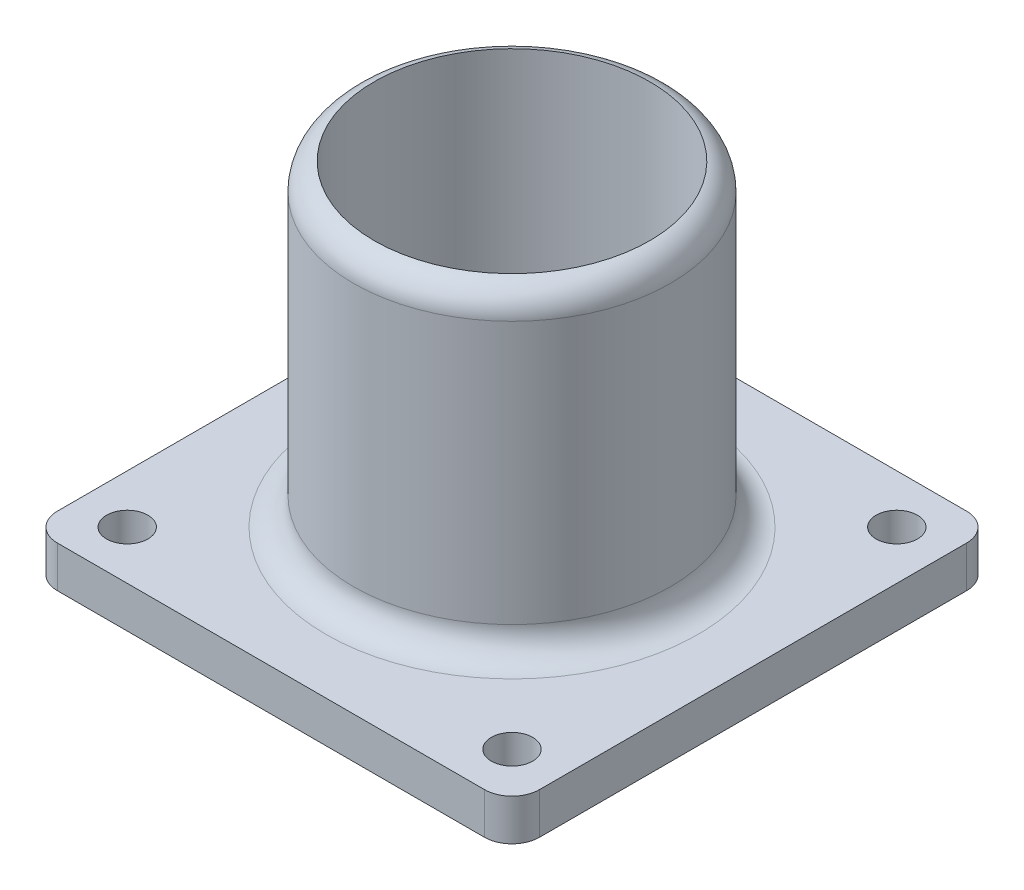
ISO-10303-21;
HEADER;
FILE_DESCRIPTION(('STEP AP214'),'2;1');
FILE_NAME('part.step','',(''),(''),'','','');
FILE_SCHEMA(('AUTOMOTIVE_DESIGN { 1 0 10303 214 1 1 1 1 }'));
ENDSEC;
DATA;
#1=APPLICATION_CONTEXT('core data for automotive mechanical design processes');
#2=APPLICATION_PROTOCOL_DEFINITION('international standard','automotive_design',2000,#1);
#3=PRODUCT_CONTEXT('',#1,'mechanical');
#4=PRODUCT('Part','Part','',(#3));
#5=PRODUCT_RELATED_PRODUCT_CATEGORY('part','',(#4));
#6=PRODUCT_DEFINITION_FORMATION('','',#4);
#7=PRODUCT_DEFINITION_CONTEXT('part definition',#1,'design');
#8=PRODUCT_DEFINITION('design','',#6,#7);
#9=PRODUCT_DEFINITION_SHAPE('','',#8);
#10=(LENGTH_UNIT() NAMED_UNIT(*) SI_UNIT(.MILLI.,.METRE.));
#11=(NAMED_UNIT(*) PLANE_ANGLE_UNIT() SI_UNIT($,.RADIAN.));
#12=(NAMED_UNIT(*) SI_UNIT($,.STERADIAN.) SOLID_ANGLE_UNIT());
#13=UNCERTAINTY_MEASURE_WITH_UNIT(LENGTH_MEASURE(1.E-05),#10,'distance_accuracy_value','');
#14=(GEOMETRIC_REPRESENTATION_CONTEXT(3) GLOBAL_UNCERTAINTY_ASSIGNED_CONTEXT((#13)) GLOBAL_UNIT_ASSIGNED_CONTEXT((#10,
#11,#12)) REPRESENTATION_CONTEXT('',''));
#15=CARTESIAN_POINT('',(0.,0.,0.));
#16=DIRECTION('',(0.,0.,1.));
#17=DIRECTION('',(1.,0.,0.));
#18=AXIS2_PLACEMENT_3D('',#15,#16,#17);
#19=CARTESIAN_POINT('',(0.,1.5,0.));
#20=DIRECTION('',(0.,-1.,0.));
#21=DIRECTION('',(0.,0.,-1.));
#22=AXIS2_PLACEMENT_3D('',#19,#20,#21);
#23=PLANE('',#22);
#24=CARTESIAN_POINT('',(0.,1.5,0.));
#25=DIRECTION('',(0.,-1.,0.));
#26=DIRECTION('',(0.,0.,-1.));
#27=AXIS2_PLACEMENT_3D('',#24,#25,#26);
#28=CIRCLE('',#27,13.5);
#29=CARTESIAN_POINT('',(0.,1.5,-13.5));
#30=VERTEX_POINT('',#29);
#31=EDGE_CURVE('E11',#30,#30,#28,.T.);
#32=ORIENTED_EDGE('',*,*,#31,.T.);
#33=EDGE_LOOP('',(#32));
#34=FACE_BOUND('',#33,.T.);
#35=CARTESIAN_POINT('',(-13.9644660940674,1.5,13.9644660940671));
#36=DIRECTION('',(0.,1.,0.));
#37=DIRECTION('',(0.,0.,1.));
#38=AXIS2_PLACEMENT_3D('',#35,#36,#37);
#39=CIRCLE('',#38,1.5);
#40=CARTESIAN_POINT('',(-13.9644660940674,1.5,15.4644660940671));
#41=VERTEX_POINT('',#40);
#42=EDGE_CURVE('E262',#41,#41,#39,.T.);
#43=ORIENTED_EDGE('',*,*,#42,.F.);
#44=EDGE_LOOP('',(#43));
#45=FACE_BOUND('',#44,.T.);
#46=CARTESIAN_POINT('',(13.9644660940672,1.5,13.9644660940674));
#47=DIRECTION('',(0.,1.,0.));
#48=DIRECTION('',(0.,0.,1.));
#49=AXIS2_PLACEMENT_3D('',#46,#47,#48);
#50=CIRCLE('',#49,1.5);
#51=CARTESIAN_POINT('',(13.9644660940672,1.5,15.4644660940674));
#52=VERTEX_POINT('',#51);
#53=EDGE_CURVE('E256',#52,#52,#50,.T.);
#54=ORIENTED_EDGE('',*,*,#53,.F.);
#55=EDGE_LOOP('',(#54));
#56=FACE_BOUND('',#55,.T.);
#57=CARTESIAN_POINT('',(13.9644660940673,1.5,-13.9644660940672));
#58=DIRECTION('',(0.,1.,0.));
#59=DIRECTION('',(0.,0.,1.));
#60=AXIS2_PLACEMENT_3D('',#57,#58,#59);
#61=CIRCLE('',#60,1.5);
#62=CARTESIAN_POINT('',(13.9644660940673,1.5,-12.4644660940672));
#63=VERTEX_POINT('',#62);
#64=EDGE_CURVE('E251',#63,#63,#61,.T.);
#65=ORIENTED_EDGE('',*,*,#64,.F.);
#66=EDGE_LOOP('',(#65));
#67=FACE_BOUND('',#66,.T.);
#68=CARTESIAN_POINT('',(-13.9644660940673,1.5,-13.9644660940673));
#69=DIRECTION('',(0.,1.,0.));
#70=DIRECTION('',(0.,0.,1.));
#71=AXIS2_PLACEMENT_3D('',#68,#69,#70);
#72=CIRCLE('',#71,1.5);
#73=CARTESIAN_POINT('',(-13.9644660940673,1.5,-12.4644660940673));
#74=VERTEX_POINT('',#73);
#75=EDGE_CURVE('E241',#74,#74,#72,.T.);
#76=ORIENTED_EDGE('',*,*,#75,.F.);
#77=EDGE_LOOP('',(#76));
#78=FACE_BOUND('',#77,.T.);
#79=DIRECTION('',(-1.,0.,0.));
#80=VECTOR('',#79,1.);
#81=CARTESIAN_POINT('',(-17.5,1.5,-17.5));
#82=LINE('',#81,#80);
#83=CARTESIAN_POINT('',(15.5,1.5,-17.5));
#84=VERTEX_POINT('',#83);
#85=CARTESIAN_POINT('',(-15.5,1.5,-17.5));
#86=VERTEX_POINT('',#85);
#87=EDGE_CURVE('E234',#84,#86,#82,.T.);
#88=ORIENTED_EDGE('',*,*,#87,.T.);
#89=CARTESIAN_POINT('',(-15.5,1.5,-15.5));
#90=DIRECTION('',(0.,-1.,0.));
#91=DIRECTION('',(0.,0.,-1.));
#92=AXIS2_PLACEMENT_3D('',#89,#90,#91);
#93=CIRCLE('',#92,2.);
#94=CARTESIAN_POINT('',(-17.5,1.5,-15.5));
#95=VERTEX_POINT('',#94);
#96=EDGE_CURVE('E152',#86,#95,#93,.F.);
#97=ORIENTED_EDGE('',*,*,#96,.T.);
#98=DIRECTION('',(0.,0.,1.));
#99=VECTOR('',#98,1.);
#100=CARTESIAN_POINT('',(-17.5,1.5,17.5));
#101=LINE('',#100,#99);
#102=CARTESIAN_POINT('',(-17.5,1.5,15.5));
#103=VERTEX_POINT('',#102);
#104=EDGE_CURVE('E122',#95,#103,#101,.T.);
#105=ORIENTED_EDGE('',*,*,#104,.T.);
#106=CARTESIAN_POINT('',(-15.5,1.5,15.5));
#107=DIRECTION('',(0.,-1.,0.));
#108=DIRECTION('',(0.,0.,-1.));
#109=AXIS2_PLACEMENT_3D('',#106,#107,#108);
#110=CIRCLE('',#109,2.);
#111=CARTESIAN_POINT('',(-15.5,1.5,17.5));
#112=VERTEX_POINT('',#111);
#113=EDGE_CURVE('E58',#103,#112,#110,.F.);
#114=ORIENTED_EDGE('',*,*,#113,.T.);
#115=DIRECTION('',(1.,0.,0.));
#116=VECTOR('',#115,1.);
#117=CARTESIAN_POINT('',(-17.5,1.5,17.5));
#118=LINE('',#117,#116);
#119=CARTESIAN_POINT('',(15.5,1.5,17.5));
#120=VERTEX_POINT('',#119);
#121=EDGE_CURVE('E137',#112,#120,#118,.T.);
#122=ORIENTED_EDGE('',*,*,#121,.T.);
#123=CARTESIAN_POINT('',(15.5,1.5,15.5));
#124=DIRECTION('',(0.,-1.,0.));
#125=DIRECTION('',(0.,0.,-1.));
#126=AXIS2_PLACEMENT_3D('',#123,#124,#125);
#127=CIRCLE('',#126,2.);
#128=CARTESIAN_POINT('',(17.5,1.5,15.5));
#129=VERTEX_POINT('',#128);
#130=EDGE_CURVE('E147',#120,#129,#127,.F.);
#131=ORIENTED_EDGE('',*,*,#130,.T.);
#132=DIRECTION('',(0.,0.,-1.));
#133=VECTOR('',#132,1.);
#134=CARTESIAN_POINT('',(17.5,1.5,17.5));
#135=LINE('',#134,#133);
#136=CARTESIAN_POINT('',(17.5,1.5,-15.5));
#137=VERTEX_POINT('',#136);
#138=EDGE_CURVE('E134',#129,#137,#135,.T.);
#139=ORIENTED_EDGE('',*,*,#138,.T.);
#140=CARTESIAN_POINT('',(15.5,1.5,-15.5));
#141=DIRECTION('',(0.,-1.,0.));
#142=DIRECTION('',(0.,0.,-1.));
#143=AXIS2_PLACEMENT_3D('',#140,#141,#142);
#144=CIRCLE('',#143,2.);
#145=EDGE_CURVE('E155',#137,#84,#144,.F.);
#146=ORIENTED_EDGE('',*,*,#145,.T.);
#147=EDGE_LOOP('',(#88,#97,#105,#114,#122,#131,#139,#146));
#148=FACE_BOUND('',#147,.T.);
#149=ADVANCED_FACE('F36',(#34,#45,#56,#67,#78,#148),#23,.F.);
#150=CARTESIAN_POINT('',(0.,-1.5,0.));
#151=DIRECTION('',(0.,-1.,0.));
#152=DIRECTION('',(0.,0.,-1.));
#153=AXIS2_PLACEMENT_3D('',#150,#151,#152);
#154=PLANE('',#153);
#155=CARTESIAN_POINT('',(13.9644660940672,-1.5,13.9644660940674));
#156=DIRECTION('',(0.,1.,0.));
#157=DIRECTION('',(0.,0.,1.));
#158=AXIS2_PLACEMENT_3D('',#155,#156,#157);
#159=CIRCLE('',#158,1.5);
#160=CARTESIAN_POINT('',(13.9644660940672,-1.5,15.4644660940674));
#161=VERTEX_POINT('',#160);
#162=EDGE_CURVE('E261',#161,#161,#159,.T.);
#163=ORIENTED_EDGE('',*,*,#162,.T.);
#164=EDGE_LOOP('',(#163));
#165=FACE_BOUND('',#164,.T.);
#166=CARTESIAN_POINT('',(-13.9644660940673,-1.5,-13.9644660940673));
#167=DIRECTION('',(0.,1.,0.));
#168=DIRECTION('',(0.,0.,1.));
#169=AXIS2_PLACEMENT_3D('',#166,#167,#168);
#170=CIRCLE('',#169,1.5);
#171=CARTESIAN_POINT('',(-13.9644660940673,-1.5,-12.4644660940673));
#172=VERTEX_POINT('',#171);
#173=EDGE_CURVE('E246',#172,#172,#170,.T.);
#174=ORIENTED_EDGE('',*,*,#173,.T.);
#175=EDGE_LOOP('',(#174));
#176=FACE_BOUND('',#175,.T.);
#177=DIRECTION('',(0.,0.,1.));
#178=VECTOR('',#177,1.);
#179=CARTESIAN_POINT('',(-17.5,-1.5,17.5));
#180=LINE('',#179,#178);
#181=CARTESIAN_POINT('',(-17.5,-1.5,-15.5));
#182=VERTEX_POINT('',#181);
#183=CARTESIAN_POINT('',(-17.5,-1.5,15.5));
#184=VERTEX_POINT('',#183);
#185=EDGE_CURVE('E125',#182,#184,#180,.T.);
#186=ORIENTED_EDGE('',*,*,#185,.F.);
#187=CARTESIAN_POINT('',(-15.5,-1.5,-15.5));
#188=DIRECTION('',(0.,-1.,0.));
#189=DIRECTION('',(0.,0.,-1.));
#190=AXIS2_PLACEMENT_3D('',#187,#188,#189);
#191=CIRCLE('',#190,2.);
#192=CARTESIAN_POINT('',(-15.5,-1.5,-17.5));
#193=VERTEX_POINT('',#192);
#194=EDGE_CURVE('E104',#182,#193,#191,.T.);
#195=ORIENTED_EDGE('',*,*,#194,.T.);
#196=DIRECTION('',(-1.,0.,0.));
#197=VECTOR('',#196,1.);
#198=CARTESIAN_POINT('',(-17.5,-1.5,-17.5));
#199=LINE('',#198,#197);
#200=CARTESIAN_POINT('',(15.5,-1.5,-17.5));
#201=VERTEX_POINT('',#200);
#202=EDGE_CURVE('E135',#201,#193,#199,.T.);
#203=ORIENTED_EDGE('',*,*,#202,.F.);
#204=CARTESIAN_POINT('',(15.5,-1.5,-15.5));
#205=DIRECTION('',(0.,-1.,0.));
#206=DIRECTION('',(0.,0.,-1.));
#207=AXIS2_PLACEMENT_3D('',#204,#205,#206);
#208=CIRCLE('',#207,2.);
#209=CARTESIAN_POINT('',(17.5,-1.5,-15.5));
#210=VERTEX_POINT('',#209);
#211=EDGE_CURVE('E117',#201,#210,#208,.T.);
#212=ORIENTED_EDGE('',*,*,#211,.T.);
#213=DIRECTION('',(0.,0.,-1.));
#214=VECTOR('',#213,1.);
#215=CARTESIAN_POINT('',(17.5,-1.5,17.5));
#216=LINE('',#215,#214);
#217=CARTESIAN_POINT('',(17.5,-1.5,15.5));
#218=VERTEX_POINT('',#217);
#219=EDGE_CURVE('E138',#218,#210,#216,.T.);
#220=ORIENTED_EDGE('',*,*,#219,.F.);
#221=CARTESIAN_POINT('',(15.5,-1.5,15.5));
#222=DIRECTION('',(0.,-1.,0.));
#223=DIRECTION('',(0.,0.,-1.));
#224=AXIS2_PLACEMENT_3D('',#221,#222,#223);
#225=CIRCLE('',#224,2.);
#226=CARTESIAN_POINT('',(15.5,-1.5,17.5));
#227=VERTEX_POINT('',#226);
#228=EDGE_CURVE('E141',#218,#227,#225,.T.);
#229=ORIENTED_EDGE('',*,*,#228,.T.);
#230=DIRECTION('',(1.,0.,0.));
#231=VECTOR('',#230,1.);
#232=CARTESIAN_POINT('',(-17.5,-1.5,17.5));
#233=LINE('',#232,#231);
#234=CARTESIAN_POINT('',(-15.5,-1.5,17.5));
#235=VERTEX_POINT('',#234);
#236=EDGE_CURVE('E132',#235,#227,#233,.T.);
#237=ORIENTED_EDGE('',*,*,#236,.F.);
#238=CARTESIAN_POINT('',(-15.5,-1.5,15.5));
#239=DIRECTION('',(0.,-1.,0.));
#240=DIRECTION('',(0.,0.,-1.));
#241=AXIS2_PLACEMENT_3D('',#238,#239,#240);
#242=CIRCLE('',#241,2.);
#243=EDGE_CURVE('E124',#235,#184,#242,.T.);
#244=ORIENTED_EDGE('',*,*,#243,.T.);
#245=EDGE_LOOP('',(#186,#195,#203,#212,#220,#229,#237,#244));
#246=FACE_BOUND('',#245,.T.);
#247=CARTESIAN_POINT('',(0.,-1.5,0.));
#248=DIRECTION('',(0.,1.,0.));
#249=DIRECTION('',(0.,0.,1.));
#250=AXIS2_PLACEMENT_3D('',#247,#248,#249);
#251=CIRCLE('',#250,10.);
#252=CARTESIAN_POINT('',(0.,-1.5,10.));
#253=VERTEX_POINT('',#252);
#254=EDGE_CURVE('E238',#253,#253,#251,.T.);
#255=ORIENTED_EDGE('',*,*,#254,.T.);
#256=EDGE_LOOP('',(#255));
#257=FACE_BOUND('',#256,.T.);
#258=CARTESIAN_POINT('',(13.9644660940673,-1.5,-13.9644660940672));
#259=DIRECTION('',(0.,1.,0.));
#260=DIRECTION('',(0.,0.,1.));
#261=AXIS2_PLACEMENT_3D('',#258,#259,#260);
#262=CIRCLE('',#261,1.5);
#263=CARTESIAN_POINT('',(13.9644660940673,-1.5,-12.4644660940672));
#264=VERTEX_POINT('',#263);
#265=EDGE_CURVE('E254',#264,#264,#262,.T.);
#266=ORIENTED_EDGE('',*,*,#265,.T.);
#267=EDGE_LOOP('',(#266));
#268=FACE_BOUND('',#267,.T.);
#269=CARTESIAN_POINT('',(-13.9644660940674,-1.5,13.9644660940671));
#270=DIRECTION('',(0.,1.,0.));
#271=DIRECTION('',(0.,0.,1.));
#272=AXIS2_PLACEMENT_3D('',#269,#270,#271);
#273=CIRCLE('',#272,1.5);
#274=CARTESIAN_POINT('',(-13.9644660940674,-1.5,15.4644660940671));
#275=VERTEX_POINT('',#274);
#276=EDGE_CURVE('E270',#275,#275,#273,.T.);
#277=ORIENTED_EDGE('',*,*,#276,.T.);
#278=EDGE_LOOP('',(#277));
#279=FACE_BOUND('',#278,.T.);
#280=ADVANCED_FACE('F126',(#165,#176,#246,#257,#268,#279),#154,.T.);
#281=CARTESIAN_POINT('',(17.5,1.5,17.5));
#282=DIRECTION('',(-1.,0.,0.));
#283=DIRECTION('',(0.,0.,1.));
#284=AXIS2_PLACEMENT_3D('',#281,#282,#283);
#285=PLANE('',#284);
#286=ORIENTED_EDGE('',*,*,#219,.T.);
#287=DIRECTION('',(0.,-1.,0.));
#288=VECTOR('',#287,1.);
#289=CARTESIAN_POINT('',(17.5,1.5,-15.5));
#290=LINE('',#289,#288);
#291=EDGE_CURVE('E157',#210,#137,#290,.F.);
#292=ORIENTED_EDGE('',*,*,#291,.T.);
#293=ORIENTED_EDGE('',*,*,#138,.F.);
#294=DIRECTION('',(0.,-1.,0.));
#295=VECTOR('',#294,1.);
#296=CARTESIAN_POINT('',(17.5,1.5,15.5));
#297=LINE('',#296,#295);
#298=EDGE_CURVE('E156',#129,#218,#297,.T.);
#299=ORIENTED_EDGE('',*,*,#298,.T.);
#300=EDGE_LOOP('',(#286,#292,#293,#299));
#301=FACE_BOUND('',#300,.T.);
#302=ADVANCED_FACE('F195',(#301),#285,.F.);
#303=CARTESIAN_POINT('',(-17.5,1.5,-17.5));
#304=DIRECTION('',(0.,0.,1.));
#305=DIRECTION('',(1.,0.,0.));
#306=AXIS2_PLACEMENT_3D('',#303,#304,#305);
#307=PLANE('',#306);
#308=ORIENTED_EDGE('',*,*,#202,.T.);
#309=DIRECTION('',(0.,-1.,0.));
#310=VECTOR('',#309,1.);
#311=CARTESIAN_POINT('',(-15.5,1.5,-17.5));
#312=LINE('',#311,#310);
#313=EDGE_CURVE('E109',#193,#86,#312,.F.);
#314=ORIENTED_EDGE('',*,*,#313,.T.);
#315=ORIENTED_EDGE('',*,*,#87,.F.);
#316=DIRECTION('',(0.,-1.,0.));
#317=VECTOR('',#316,1.);
#318=CARTESIAN_POINT('',(15.5,1.5,-17.5));
#319=LINE('',#318,#317);
#320=EDGE_CURVE('E113',#84,#201,#319,.T.);
#321=ORIENTED_EDGE('',*,*,#320,.T.);
#322=EDGE_LOOP('',(#308,#314,#315,#321));
#323=FACE_BOUND('',#322,.T.);
#324=ADVANCED_FACE('F202',(#323),#307,.F.);
#325=CARTESIAN_POINT('',(-17.5,1.5,17.5));
#326=DIRECTION('',(1.,0.,0.));
#327=DIRECTION('',(0.,0.,-1.));
#328=AXIS2_PLACEMENT_3D('',#325,#326,#327);
#329=PLANE('',#328);
#330=ORIENTED_EDGE('',*,*,#104,.F.);
#331=DIRECTION('',(0.,-1.,0.));
#332=VECTOR('',#331,1.);
#333=CARTESIAN_POINT('',(-17.5,1.5,-15.5));
#334=LINE('',#333,#332);
#335=EDGE_CURVE('E108',#95,#182,#334,.T.);
#336=ORIENTED_EDGE('',*,*,#335,.T.);
#337=ORIENTED_EDGE('',*,*,#185,.T.);
#338=DIRECTION('',(0.,-1.,0.));
#339=VECTOR('',#338,1.);
#340=CARTESIAN_POINT('',(-17.5,1.5,15.5));
#341=LINE('',#340,#339);
#342=EDGE_CURVE('E127',#184,#103,#341,.F.);
#343=ORIENTED_EDGE('',*,*,#342,.T.);
#344=EDGE_LOOP('',(#330,#336,#337,#343));
#345=FACE_BOUND('',#344,.T.);
#346=ADVANCED_FACE('F123',(#345),#329,.F.);
#347=CARTESIAN_POINT('',(-17.5,1.5,17.5));
#348=DIRECTION('',(0.,0.,-1.));
#349=DIRECTION('',(-1.,0.,0.));
#350=AXIS2_PLACEMENT_3D('',#347,#348,#349);
#351=PLANE('',#350);
#352=ORIENTED_EDGE('',*,*,#236,.T.);
#353=DIRECTION('',(0.,-1.,0.));
#354=VECTOR('',#353,1.);
#355=CARTESIAN_POINT('',(15.5,1.5,17.5));
#356=LINE('',#355,#354);
#357=EDGE_CURVE('E52',#227,#120,#356,.F.);
#358=ORIENTED_EDGE('',*,*,#357,.T.);
#359=ORIENTED_EDGE('',*,*,#121,.F.);
#360=DIRECTION('',(0.,-1.,0.));
#361=VECTOR('',#360,1.);
#362=CARTESIAN_POINT('',(-15.5,1.5,17.5));
#363=LINE('',#362,#361);
#364=EDGE_CURVE('E161',#112,#235,#363,.T.);
#365=ORIENTED_EDGE('',*,*,#364,.T.);
#366=EDGE_LOOP('',(#352,#358,#359,#365));
#367=FACE_BOUND('',#366,.T.);
#368=ADVANCED_FACE('F199',(#367),#351,.F.);
#369=CARTESIAN_POINT('',(0.,1.5,0.));
#370=DIRECTION('',(0.,-1.,0.));
#371=DIRECTION('',(0.,0.,-1.));
#372=AXIS2_PLACEMENT_3D('',#369,#370,#371);
#373=CYLINDRICAL_SURFACE('',#372,10.);
#374=ORIENTED_EDGE('',*,*,#254,.F.);
#375=EDGE_LOOP('',(#374));
#376=FACE_BOUND('',#375,.T.);
#377=CARTESIAN_POINT('',(0.,24.5,0.));
#378=DIRECTION('',(0.,1.,0.));
#379=DIRECTION('',(0.,0.,1.));
#380=AXIS2_PLACEMENT_3D('',#377,#378,#379);
#381=CIRCLE('',#380,10.);
#382=CARTESIAN_POINT('',(0.,24.5,10.));
#383=VERTEX_POINT('',#382);
#384=EDGE_CURVE('E269',#383,#383,#381,.T.);
#385=ORIENTED_EDGE('',*,*,#384,.T.);
#386=EDGE_LOOP('',(#385));
#387=FACE_BOUND('',#386,.T.);
#388=ADVANCED_FACE('F197',(#376,#387),#373,.F.);
#389=CARTESIAN_POINT('',(-13.9644660940673,1.5,-13.9644660940673));
#390=DIRECTION('',(0.,-1.,0.));
#391=DIRECTION('',(0.,0.,-1.));
#392=AXIS2_PLACEMENT_3D('',#389,#390,#391);
#393=CYLINDRICAL_SURFACE('',#392,1.5);
#394=ORIENTED_EDGE('',*,*,#75,.T.);
#395=EDGE_LOOP('',(#394));
#396=FACE_BOUND('',#395,.T.);
#397=ORIENTED_EDGE('',*,*,#173,.F.);
#398=EDGE_LOOP('',(#397));
#399=FACE_BOUND('',#398,.T.);
#400=ADVANCED_FACE('F280',(#396,#399),#393,.F.);
#401=CARTESIAN_POINT('',(13.9644660940673,1.5,-13.9644660940672));
#402=DIRECTION('',(0.,-1.,0.));
#403=DIRECTION('',(0.,0.,-1.));
#404=AXIS2_PLACEMENT_3D('',#401,#402,#403);
#405=CYLINDRICAL_SURFACE('',#404,1.5);
#406=ORIENTED_EDGE('',*,*,#64,.T.);
#407=EDGE_LOOP('',(#406));
#408=FACE_BOUND('',#407,.T.);
#409=ORIENTED_EDGE('',*,*,#265,.F.);
#410=EDGE_LOOP('',(#409));
#411=FACE_BOUND('',#410,.T.);
#412=ADVANCED_FACE('F285',(#408,#411),#405,.F.);
#413=CARTESIAN_POINT('',(13.9644660940672,1.5,13.9644660940674));
#414=DIRECTION('',(0.,-1.,0.));
#415=DIRECTION('',(0.,0.,-1.));
#416=AXIS2_PLACEMENT_3D('',#413,#414,#415);
#417=CYLINDRICAL_SURFACE('',#416,1.5);
#418=ORIENTED_EDGE('',*,*,#53,.T.);
#419=EDGE_LOOP('',(#418));
#420=FACE_BOUND('',#419,.T.);
#421=ORIENTED_EDGE('',*,*,#162,.F.);
#422=EDGE_LOOP('',(#421));
#423=FACE_BOUND('',#422,.T.);
#424=ADVANCED_FACE('F288',(#420,#423),#417,.F.);
#425=CARTESIAN_POINT('',(-13.9644660940674,1.5,13.9644660940671));
#426=DIRECTION('',(0.,-1.,0.));
#427=DIRECTION('',(0.,0.,-1.));
#428=AXIS2_PLACEMENT_3D('',#425,#426,#427);
#429=CYLINDRICAL_SURFACE('',#428,1.5);
#430=ORIENTED_EDGE('',*,*,#42,.T.);
#431=EDGE_LOOP('',(#430));
#432=FACE_BOUND('',#431,.T.);
#433=ORIENTED_EDGE('',*,*,#276,.F.);
#434=EDGE_LOOP('',(#433));
#435=FACE_BOUND('',#434,.T.);
#436=ADVANCED_FACE('F214',(#432,#435),#429,.F.);
#437=CARTESIAN_POINT('',(-15.5,1.5,-15.5));
#438=DIRECTION('',(0.,-1.,0.));
#439=DIRECTION('',(0.,0.,-1.));
#440=AXIS2_PLACEMENT_3D('',#437,#438,#439);
#441=CYLINDRICAL_SURFACE('',#440,2.);
#442=ORIENTED_EDGE('',*,*,#96,.F.);
#443=ORIENTED_EDGE('',*,*,#313,.F.);
#444=ORIENTED_EDGE('',*,*,#194,.F.);
#445=ORIENTED_EDGE('',*,*,#335,.F.);
#446=EDGE_LOOP('',(#442,#443,#444,#445));
#447=FACE_BOUND('',#446,.T.);
#448=ADVANCED_FACE('F107',(#447),#441,.T.);
#449=CARTESIAN_POINT('',(15.5,1.5,-15.5));
#450=DIRECTION('',(0.,-1.,0.));
#451=DIRECTION('',(0.,0.,-1.));
#452=AXIS2_PLACEMENT_3D('',#449,#450,#451);
#453=CYLINDRICAL_SURFACE('',#452,2.);
#454=ORIENTED_EDGE('',*,*,#145,.F.);
#455=ORIENTED_EDGE('',*,*,#291,.F.);
#456=ORIENTED_EDGE('',*,*,#211,.F.);
#457=ORIENTED_EDGE('',*,*,#320,.F.);
#458=EDGE_LOOP('',(#454,#455,#456,#457));
#459=FACE_BOUND('',#458,.T.);
#460=ADVANCED_FACE('F212',(#459),#453,.T.);
#461=CARTESIAN_POINT('',(15.5,1.5,15.5));
#462=DIRECTION('',(0.,-1.,0.));
#463=DIRECTION('',(0.,0.,-1.));
#464=AXIS2_PLACEMENT_3D('',#461,#462,#463);
#465=CYLINDRICAL_SURFACE('',#464,2.);
#466=ORIENTED_EDGE('',*,*,#130,.F.);
#467=ORIENTED_EDGE('',*,*,#357,.F.);
#468=ORIENTED_EDGE('',*,*,#228,.F.);
#469=ORIENTED_EDGE('',*,*,#298,.F.);
#470=EDGE_LOOP('',(#466,#467,#468,#469));
#471=FACE_BOUND('',#470,.T.);
#472=ADVANCED_FACE('F217',(#471),#465,.T.);
#473=CARTESIAN_POINT('',(-15.5,1.5,15.5));
#474=DIRECTION('',(0.,-1.,0.));
#475=DIRECTION('',(0.,0.,-1.));
#476=AXIS2_PLACEMENT_3D('',#473,#474,#475);
#477=CYLINDRICAL_SURFACE('',#476,2.);
#478=ORIENTED_EDGE('',*,*,#113,.F.);
#479=ORIENTED_EDGE('',*,*,#342,.F.);
#480=ORIENTED_EDGE('',*,*,#243,.F.);
#481=ORIENTED_EDGE('',*,*,#364,.F.);
#482=EDGE_LOOP('',(#478,#479,#480,#481));
#483=FACE_BOUND('',#482,.T.);
#484=ADVANCED_FACE('F182',(#483),#477,.T.);
#485=CARTESIAN_POINT('',(0.,24.5,0.));
#486=DIRECTION('',(0.,-1.,0.));
#487=DIRECTION('',(0.,0.,-1.));
#488=AXIS2_PLACEMENT_3D('',#485,#486,#487);
#489=CYLINDRICAL_SURFACE('',#488,11.5);
#490=CARTESIAN_POINT('',(0.,3.5,0.));
#491=DIRECTION('',(0.,-1.,0.));
#492=DIRECTION('',(0.,0.,-1.));
#493=AXIS2_PLACEMENT_3D('',#490,#491,#492);
#494=CIRCLE('',#493,11.5);
#495=CARTESIAN_POINT('',(0.,3.5,-11.5));
#496=VERTEX_POINT('',#495);
#497=EDGE_CURVE('E46',#496,#496,#494,.F.);
#498=ORIENTED_EDGE('',*,*,#497,.T.);
#499=EDGE_LOOP('',(#498));
#500=FACE_BOUND('',#499,.T.);
#501=CARTESIAN_POINT('',(0.,22.5635083268963,0.));
#502=DIRECTION('',(0.,1.,0.));
#503=DIRECTION('',(0.,0.,1.));
#504=AXIS2_PLACEMENT_3D('',#501,#502,#503);
#505=CIRCLE('',#504,11.5);
#506=CARTESIAN_POINT('',(0.,22.5635083268963,11.5));
#507=VERTEX_POINT('',#506);
#508=EDGE_CURVE('E164',#507,#507,#505,.F.);
#509=ORIENTED_EDGE('',*,*,#508,.T.);
#510=EDGE_LOOP('',(#509));
#511=FACE_BOUND('',#510,.T.);
#512=ADVANCED_FACE('F168',(#500,#511),#489,.T.);
#513=CARTESIAN_POINT('',(0.,3.5,0.));
#514=DIRECTION('',(0.,-1.,0.));
#515=DIRECTION('',(0.,0.,-1.));
#516=AXIS2_PLACEMENT_3D('',#513,#514,#515);
#517=TOROIDAL_SURFACE('',#516,13.5,2.);
#518=ORIENTED_EDGE('',*,*,#31,.F.);
#519=EDGE_LOOP('',(#518));
#520=FACE_BOUND('',#519,.T.);
#521=ORIENTED_EDGE('',*,*,#497,.F.);
#522=EDGE_LOOP('',(#521));
#523=FACE_BOUND('',#522,.T.);
#524=ADVANCED_FACE('F173',(#520,#523),#517,.F.);
#525=CARTESIAN_POINT('',(0.,22.5635083268963,0.));
#526=DIRECTION('',(0.,1.,0.));
#527=DIRECTION('',(0.,0.,1.));
#528=AXIS2_PLACEMENT_3D('',#525,#526,#527);
#529=TOROIDAL_SURFACE('',#528,9.5,2.);
#530=ORIENTED_EDGE('',*,*,#508,.F.);
#531=EDGE_LOOP('',(#530));
#532=FACE_BOUND('',#531,.T.);
#533=ORIENTED_EDGE('',*,*,#384,.F.);
#534=EDGE_LOOP('',(#533));
#535=FACE_BOUND('',#534,.T.);
#536=ADVANCED_FACE('F37',(#532,#535),#529,.T.);
#537=CLOSED_SHELL('',(#149,#280,#302,#324,#346,#368,#388,#400,#412,#424,#436,#448,#460,#472,
#484,#512,#524,#536));
#538=MANIFOLD_SOLID_BREP('B2',#537);
#539=ADVANCED_BREP_SHAPE_REPRESENTATION('',(#18,#538),#14);
#540=SHAPE_DEFINITION_REPRESENTATION(#9,#539);
ENDSEC;
END-ISO-10303-21;
